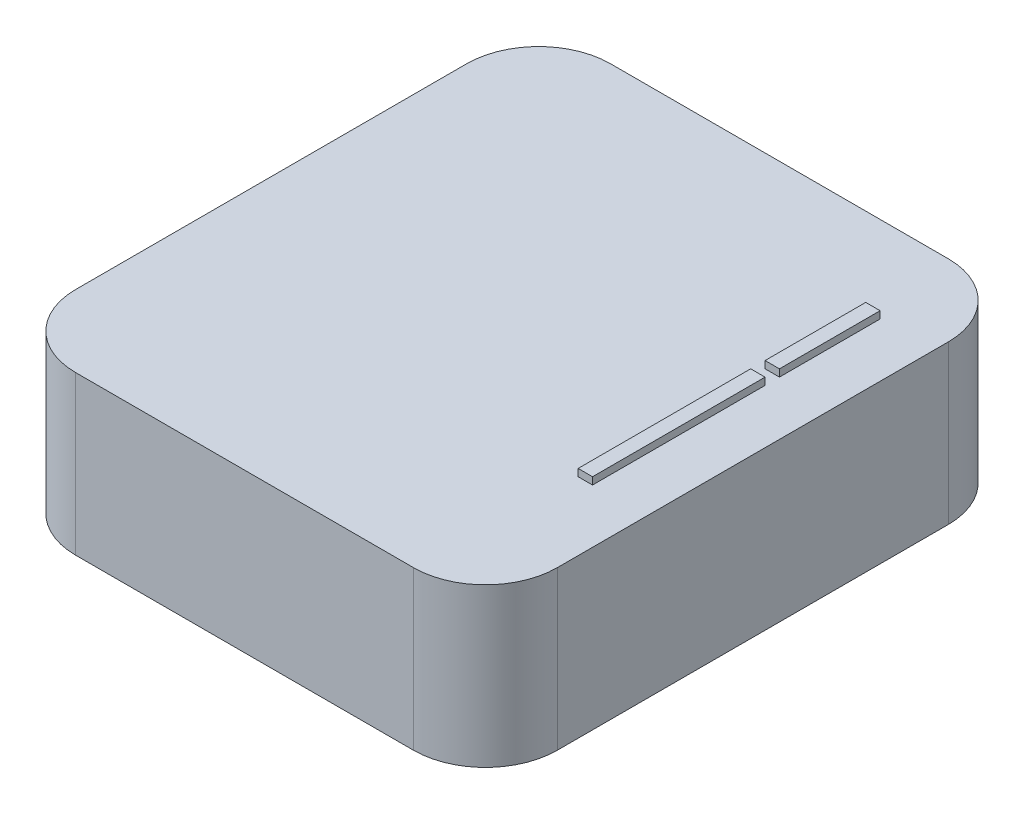
ISO-10303-21;
HEADER;
FILE_DESCRIPTION(('STEP AP214'),'2;1');
FILE_NAME('part.step','',(''),(''),'','','');
FILE_SCHEMA(('AUTOMOTIVE_DESIGN { 1 0 10303 214 1 1 1 1 }'));
ENDSEC;
DATA;
#1=APPLICATION_CONTEXT('core data for automotive mechanical design processes');
#2=APPLICATION_PROTOCOL_DEFINITION('international standard','automotive_design',2000,#1);
#3=PRODUCT_CONTEXT('',#1,'mechanical');
#4=PRODUCT('Part','Part','',(#3));
#5=PRODUCT_RELATED_PRODUCT_CATEGORY('part','',(#4));
#6=PRODUCT_DEFINITION_FORMATION('','',#4);
#7=PRODUCT_DEFINITION_CONTEXT('part definition',#1,'design');
#8=PRODUCT_DEFINITION('design','',#6,#7);
#9=PRODUCT_DEFINITION_SHAPE('','',#8);
#10=(LENGTH_UNIT() NAMED_UNIT(*) SI_UNIT(.MILLI.,.METRE.));
#11=(NAMED_UNIT(*) PLANE_ANGLE_UNIT() SI_UNIT($,.RADIAN.));
#12=(NAMED_UNIT(*) SI_UNIT($,.STERADIAN.) SOLID_ANGLE_UNIT());
#13=UNCERTAINTY_MEASURE_WITH_UNIT(LENGTH_MEASURE(1.E-05),#10,'distance_accuracy_value','');
#14=(GEOMETRIC_REPRESENTATION_CONTEXT(3) GLOBAL_UNCERTAINTY_ASSIGNED_CONTEXT((#13)) GLOBAL_UNIT_ASSIGNED_CONTEXT((#10,
#11,#12)) REPRESENTATION_CONTEXT('',''));
#15=CARTESIAN_POINT('',(0.,0.,0.));
#16=DIRECTION('',(0.,0.,1.));
#17=DIRECTION('',(1.,0.,0.));
#18=AXIS2_PLACEMENT_3D('',#15,#16,#17);
#19=CARTESIAN_POINT('',(0.,22.,0.));
#20=DIRECTION('',(0.,-1.,0.));
#21=DIRECTION('',(0.,0.,-1.));
#22=AXIS2_PLACEMENT_3D('',#19,#20,#21);
#23=PLANE('',#22);
#24=DIRECTION('',(0.,0.,1.));
#25=VECTOR('',#24,1.);
#26=CARTESIAN_POINT('',(24.,22.,-25.2));
#27=LINE('',#26,#25);
#28=CARTESIAN_POINT('',(24.,22.,-25.2));
#29=VERTEX_POINT('',#28);
#30=CARTESIAN_POINT('',(24.,22.,-11.2));
#31=VERTEX_POINT('',#30);
#32=EDGE_CURVE('E217',#29,#31,#27,.T.);
#33=ORIENTED_EDGE('',*,*,#32,.F.);
#34=DIRECTION('',(-1.,0.,0.));
#35=VECTOR('',#34,1.);
#36=CARTESIAN_POINT('',(24.,22.,-25.2));
#37=LINE('',#36,#35);
#38=CARTESIAN_POINT('',(26.,22.,-25.2));
#39=VERTEX_POINT('',#38);
#40=EDGE_CURVE('E230',#39,#29,#37,.T.);
#41=ORIENTED_EDGE('',*,*,#40,.F.);
#42=DIRECTION('',(0.,0.,-1.));
#43=VECTOR('',#42,1.);
#44=CARTESIAN_POINT('',(26.,22.,-25.2));
#45=LINE('',#44,#43);
#46=CARTESIAN_POINT('',(26.,22.,-11.2));
#47=VERTEX_POINT('',#46);
#48=EDGE_CURVE('E239',#47,#39,#45,.T.);
#49=ORIENTED_EDGE('',*,*,#48,.F.);
#50=DIRECTION('',(1.,0.,0.));
#51=VECTOR('',#50,1.);
#52=CARTESIAN_POINT('',(24.,22.,-11.2));
#53=LINE('',#52,#51);
#54=EDGE_CURVE('E220',#31,#47,#53,.T.);
#55=ORIENTED_EDGE('',*,*,#54,.F.);
#56=EDGE_LOOP('',(#33,#41,#49,#55));
#57=FACE_BOUND('',#56,.T.);
#58=DIRECTION('',(-1.,0.,0.));
#59=VECTOR('',#58,1.);
#60=CARTESIAN_POINT('',(-33.5,22.,-37.2));
#61=LINE('',#60,#59);
#62=CARTESIAN_POINT('',(23.5,22.,-37.2));
#63=VERTEX_POINT('',#62);
#64=CARTESIAN_POINT('',(-23.5,22.,-37.2));
#65=VERTEX_POINT('',#64);
#66=EDGE_CURVE('E323',#63,#65,#61,.T.);
#67=ORIENTED_EDGE('',*,*,#66,.T.);
#68=CARTESIAN_POINT('',(-23.5,22.,-27.2));
#69=DIRECTION('',(0.,-1.,0.));
#70=DIRECTION('',(0.,0.,-1.));
#71=AXIS2_PLACEMENT_3D('',#68,#69,#70);
#72=CIRCLE('',#71,10.);
#73=CARTESIAN_POINT('',(-33.5,22.,-27.2));
#74=VERTEX_POINT('',#73);
#75=EDGE_CURVE('E367',#65,#74,#72,.F.);
#76=ORIENTED_EDGE('',*,*,#75,.T.);
#77=DIRECTION('',(0.,0.,1.));
#78=VECTOR('',#77,1.);
#79=CARTESIAN_POINT('',(-33.5,22.,37.2));
#80=LINE('',#79,#78);
#81=CARTESIAN_POINT('',(-33.5,22.,27.2));
#82=VERTEX_POINT('',#81);
#83=EDGE_CURVE('E327',#74,#82,#80,.T.);
#84=ORIENTED_EDGE('',*,*,#83,.T.);
#85=CARTESIAN_POINT('',(-23.5,22.,27.2));
#86=DIRECTION('',(0.,-1.,0.));
#87=DIRECTION('',(0.,0.,-1.));
#88=AXIS2_PLACEMENT_3D('',#85,#86,#87);
#89=CIRCLE('',#88,10.);
#90=CARTESIAN_POINT('',(-23.5,22.,37.2));
#91=VERTEX_POINT('',#90);
#92=EDGE_CURVE('E363',#82,#91,#89,.F.);
#93=ORIENTED_EDGE('',*,*,#92,.T.);
#94=DIRECTION('',(1.,0.,0.));
#95=VECTOR('',#94,1.);
#96=CARTESIAN_POINT('',(-33.5,22.,37.2));
#97=LINE('',#96,#95);
#98=CARTESIAN_POINT('',(23.5,22.,37.2));
#99=VERTEX_POINT('',#98);
#100=EDGE_CURVE('E330',#91,#99,#97,.T.);
#101=ORIENTED_EDGE('',*,*,#100,.T.);
#102=CARTESIAN_POINT('',(23.5,22.,27.2));
#103=DIRECTION('',(0.,-1.,0.));
#104=DIRECTION('',(0.,0.,-1.));
#105=AXIS2_PLACEMENT_3D('',#102,#103,#104);
#106=CIRCLE('',#105,10.);
#107=CARTESIAN_POINT('',(33.5,22.,27.2));
#108=VERTEX_POINT('',#107);
#109=EDGE_CURVE('E361',#99,#108,#106,.F.);
#110=ORIENTED_EDGE('',*,*,#109,.T.);
#111=DIRECTION('',(0.,0.,-1.));
#112=VECTOR('',#111,1.);
#113=CARTESIAN_POINT('',(33.5,22.,37.2));
#114=LINE('',#113,#112);
#115=CARTESIAN_POINT('',(33.5,22.,-27.2));
#116=VERTEX_POINT('',#115);
#117=EDGE_CURVE('E320',#108,#116,#114,.T.);
#118=ORIENTED_EDGE('',*,*,#117,.T.);
#119=CARTESIAN_POINT('',(23.5,22.,-27.2));
#120=DIRECTION('',(0.,-1.,0.));
#121=DIRECTION('',(0.,0.,-1.));
#122=AXIS2_PLACEMENT_3D('',#119,#120,#121);
#123=CIRCLE('',#122,10.);
#124=EDGE_CURVE('E365',#116,#63,#123,.F.);
#125=ORIENTED_EDGE('',*,*,#124,.T.);
#126=EDGE_LOOP('',(#67,#76,#84,#93,#101,#110,#118,#125));
#127=FACE_BOUND('',#126,.T.);
#128=DIRECTION('',(0.,0.,1.));
#129=VECTOR('',#128,1.);
#130=CARTESIAN_POINT('',(24.,22.,-9.20000000000001));
#131=LINE('',#130,#129);
#132=CARTESIAN_POINT('',(24.,22.,-9.20000000000001));
#133=VERTEX_POINT('',#132);
#134=CARTESIAN_POINT('',(24.,22.,14.8));
#135=VERTEX_POINT('',#134);
#136=EDGE_CURVE('E216',#133,#135,#131,.T.);
#137=ORIENTED_EDGE('',*,*,#136,.F.);
#138=DIRECTION('',(-1.,0.,0.));
#139=VECTOR('',#138,1.);
#140=CARTESIAN_POINT('',(24.,22.,-9.20000000000001));
#141=LINE('',#140,#139);
#142=CARTESIAN_POINT('',(26.,22.,-9.20000000000001));
#143=VERTEX_POINT('',#142);
#144=EDGE_CURVE('E213',#143,#133,#141,.T.);
#145=ORIENTED_EDGE('',*,*,#144,.F.);
#146=DIRECTION('',(0.,0.,-1.));
#147=VECTOR('',#146,1.);
#148=CARTESIAN_POINT('',(26.,22.,-9.20000000000001));
#149=LINE('',#148,#147);
#150=CARTESIAN_POINT('',(26.,22.,14.8));
#151=VERTEX_POINT('',#150);
#152=EDGE_CURVE('E55',#151,#143,#149,.T.);
#153=ORIENTED_EDGE('',*,*,#152,.F.);
#154=DIRECTION('',(1.,0.,0.));
#155=VECTOR('',#154,1.);
#156=CARTESIAN_POINT('',(24.,22.,14.8));
#157=LINE('',#156,#155);
#158=EDGE_CURVE('E50',#135,#151,#157,.T.);
#159=ORIENTED_EDGE('',*,*,#158,.F.);
#160=EDGE_LOOP('',(#137,#145,#153,#159));
#161=FACE_BOUND('',#160,.T.);
#162=ADVANCED_FACE('F35',(#57,#127,#161),#23,.F.);
#163=CARTESIAN_POINT('',(33.5,22.,37.2));
#164=DIRECTION('',(-1.,0.,0.));
#165=DIRECTION('',(0.,0.,1.));
#166=AXIS2_PLACEMENT_3D('',#163,#164,#165);
#167=PLANE('',#166);
#168=DIRECTION('',(0.,0.,-1.));
#169=VECTOR('',#168,1.);
#170=CARTESIAN_POINT('',(33.5,0.,37.2));
#171=LINE('',#170,#169);
#172=CARTESIAN_POINT('',(33.5,0.,27.2));
#173=VERTEX_POINT('',#172);
#174=CARTESIAN_POINT('',(33.5,0.,-27.2));
#175=VERTEX_POINT('',#174);
#176=EDGE_CURVE('E313',#173,#175,#171,.T.);
#177=ORIENTED_EDGE('',*,*,#176,.T.);
#178=DIRECTION('',(0.,-1.,0.));
#179=VECTOR('',#178,1.);
#180=CARTESIAN_POINT('',(33.5,22.,-27.2));
#181=LINE('',#180,#179);
#182=EDGE_CURVE('E372',#175,#116,#181,.F.);
#183=ORIENTED_EDGE('',*,*,#182,.T.);
#184=ORIENTED_EDGE('',*,*,#117,.F.);
#185=DIRECTION('',(0.,-1.,0.));
#186=VECTOR('',#185,1.);
#187=CARTESIAN_POINT('',(33.5,22.,27.2));
#188=LINE('',#187,#186);
#189=EDGE_CURVE('E369',#108,#173,#188,.T.);
#190=ORIENTED_EDGE('',*,*,#189,.T.);
#191=EDGE_LOOP('',(#177,#183,#184,#190));
#192=FACE_BOUND('',#191,.T.);
#193=ADVANCED_FACE('F387',(#192),#167,.F.);
#194=CARTESIAN_POINT('',(-33.5,22.,-37.2));
#195=DIRECTION('',(0.,0.,1.));
#196=DIRECTION('',(1.,0.,0.));
#197=AXIS2_PLACEMENT_3D('',#194,#195,#196);
#198=PLANE('',#197);
#199=DIRECTION('',(1.,0.,0.));
#200=VECTOR('',#199,1.);
#201=CARTESIAN_POINT('',(-5.5,10.,-37.2));
#202=LINE('',#201,#200);
#203=CARTESIAN_POINT('',(-15.5,10.,-37.2));
#204=VERTEX_POINT('',#203);
#205=CARTESIAN_POINT('',(-5.5,10.,-37.2));
#206=VERTEX_POINT('',#205);
#207=EDGE_CURVE('E271',#204,#206,#202,.T.);
#208=ORIENTED_EDGE('',*,*,#207,.F.);
#209=DIRECTION('',(0.,1.,0.));
#210=VECTOR('',#209,1.);
#211=CARTESIAN_POINT('',(-15.5,10.,-37.2));
#212=LINE('',#211,#210);
#213=CARTESIAN_POINT('',(-15.5,5.,-37.2));
#214=VERTEX_POINT('',#213);
#215=EDGE_CURVE('E255',#214,#204,#212,.T.);
#216=ORIENTED_EDGE('',*,*,#215,.F.);
#217=DIRECTION('',(-1.,0.,0.));
#218=VECTOR('',#217,1.);
#219=CARTESIAN_POINT('',(-5.5,5.,-37.2));
#220=LINE('',#219,#218);
#221=CARTESIAN_POINT('',(-5.5,5.,-37.2));
#222=VERTEX_POINT('',#221);
#223=EDGE_CURVE('E260',#222,#214,#220,.T.);
#224=ORIENTED_EDGE('',*,*,#223,.F.);
#225=DIRECTION('',(0.,-1.,0.));
#226=VECTOR('',#225,1.);
#227=CARTESIAN_POINT('',(-5.5,10.,-37.2));
#228=LINE('',#227,#226);
#229=EDGE_CURVE('E274',#206,#222,#228,.T.);
#230=ORIENTED_EDGE('',*,*,#229,.F.);
#231=EDGE_LOOP('',(#208,#216,#224,#230));
#232=FACE_BOUND('',#231,.T.);
#233=DIRECTION('',(1.,0.,0.));
#234=VECTOR('',#233,1.);
#235=CARTESIAN_POINT('',(12.5,19.,-37.2));
#236=LINE('',#235,#234);
#237=CARTESIAN_POINT('',(-2.5,19.,-37.2));
#238=VERTEX_POINT('',#237);
#239=CARTESIAN_POINT('',(12.5,19.,-37.2));
#240=VERTEX_POINT('',#239);
#241=EDGE_CURVE('E303',#238,#240,#236,.T.);
#242=ORIENTED_EDGE('',*,*,#241,.F.);
#243=DIRECTION('',(0.,1.,0.));
#244=VECTOR('',#243,1.);
#245=CARTESIAN_POINT('',(-2.5,19.,-37.2));
#246=LINE('',#245,#244);
#247=CARTESIAN_POINT('',(-2.5,6.,-37.2));
#248=VERTEX_POINT('',#247);
#249=EDGE_CURVE('E281',#248,#238,#246,.T.);
#250=ORIENTED_EDGE('',*,*,#249,.F.);
#251=DIRECTION('',(-1.,0.,0.));
#252=VECTOR('',#251,1.);
#253=CARTESIAN_POINT('',(12.5,6.,-37.2));
#254=LINE('',#253,#252);
#255=CARTESIAN_POINT('',(12.5,6.,-37.2));
#256=VERTEX_POINT('',#255);
#257=EDGE_CURVE('E292',#256,#248,#254,.T.);
#258=ORIENTED_EDGE('',*,*,#257,.F.);
#259=DIRECTION('',(0.,-1.,0.));
#260=VECTOR('',#259,1.);
#261=CARTESIAN_POINT('',(12.5,19.,-37.2));
#262=LINE('',#261,#260);
#263=EDGE_CURVE('E306',#240,#256,#262,.T.);
#264=ORIENTED_EDGE('',*,*,#263,.F.);
#265=EDGE_LOOP('',(#242,#250,#258,#264));
#266=FACE_BOUND('',#265,.T.);
#267=DIRECTION('',(-1.,0.,0.));
#268=VECTOR('',#267,1.);
#269=CARTESIAN_POINT('',(-33.5,0.,-37.2));
#270=LINE('',#269,#268);
#271=CARTESIAN_POINT('',(23.5,0.,-37.2));
#272=VERTEX_POINT('',#271);
#273=CARTESIAN_POINT('',(-23.5,0.,-37.2));
#274=VERTEX_POINT('',#273);
#275=EDGE_CURVE('E336',#272,#274,#270,.T.);
#276=ORIENTED_EDGE('',*,*,#275,.T.);
#277=DIRECTION('',(0.,-1.,0.));
#278=VECTOR('',#277,1.);
#279=CARTESIAN_POINT('',(-23.5,22.,-37.2));
#280=LINE('',#279,#278);
#281=EDGE_CURVE('E359',#274,#65,#280,.F.);
#282=ORIENTED_EDGE('',*,*,#281,.T.);
#283=ORIENTED_EDGE('',*,*,#66,.F.);
#284=DIRECTION('',(0.,-1.,0.));
#285=VECTOR('',#284,1.);
#286=CARTESIAN_POINT('',(23.5,22.,-37.2));
#287=LINE('',#286,#285);
#288=EDGE_CURVE('E356',#63,#272,#287,.T.);
#289=ORIENTED_EDGE('',*,*,#288,.T.);
#290=EDGE_LOOP('',(#276,#282,#283,#289));
#291=FACE_BOUND('',#290,.T.);
#292=ADVANCED_FACE('F399',(#232,#266,#291),#198,.F.);
#293=CARTESIAN_POINT('',(-33.5,22.,37.2));
#294=DIRECTION('',(1.,0.,0.));
#295=DIRECTION('',(0.,0.,-1.));
#296=AXIS2_PLACEMENT_3D('',#293,#294,#295);
#297=PLANE('',#296);
#298=ORIENTED_EDGE('',*,*,#83,.F.);
#299=DIRECTION('',(0.,-1.,0.));
#300=VECTOR('',#299,1.);
#301=CARTESIAN_POINT('',(-33.5,22.,-27.2));
#302=LINE('',#301,#300);
#303=CARTESIAN_POINT('',(-33.5,0.,-27.2));
#304=VERTEX_POINT('',#303);
#305=EDGE_CURVE('E345',#74,#304,#302,.T.);
#306=ORIENTED_EDGE('',*,*,#305,.T.);
#307=DIRECTION('',(0.,0.,1.));
#308=VECTOR('',#307,1.);
#309=CARTESIAN_POINT('',(-33.5,0.,37.2));
#310=LINE('',#309,#308);
#311=CARTESIAN_POINT('',(-33.5,0.,27.2));
#312=VERTEX_POINT('',#311);
#313=EDGE_CURVE('E339',#304,#312,#310,.T.);
#314=ORIENTED_EDGE('',*,*,#313,.T.);
#315=DIRECTION('',(0.,-1.,0.));
#316=VECTOR('',#315,1.);
#317=CARTESIAN_POINT('',(-33.5,22.,27.2));
#318=LINE('',#317,#316);
#319=EDGE_CURVE('E333',#312,#82,#318,.F.);
#320=ORIENTED_EDGE('',*,*,#319,.T.);
#321=EDGE_LOOP('',(#298,#306,#314,#320));
#322=FACE_BOUND('',#321,.T.);
#323=ADVANCED_FACE('F407',(#322),#297,.F.);
#324=CARTESIAN_POINT('',(-33.5,22.,37.2));
#325=DIRECTION('',(0.,0.,-1.));
#326=DIRECTION('',(-1.,0.,0.));
#327=AXIS2_PLACEMENT_3D('',#324,#325,#326);
#328=PLANE('',#327);
#329=ORIENTED_EDGE('',*,*,#100,.F.);
#330=DIRECTION('',(0.,-1.,0.));
#331=VECTOR('',#330,1.);
#332=CARTESIAN_POINT('',(-23.5,22.,37.2));
#333=LINE('',#332,#331);
#334=CARTESIAN_POINT('',(-23.5,0.,37.2));
#335=VERTEX_POINT('',#334);
#336=EDGE_CURVE('E11',#91,#335,#333,.T.);
#337=ORIENTED_EDGE('',*,*,#336,.T.);
#338=DIRECTION('',(1.,0.,0.));
#339=VECTOR('',#338,1.);
#340=CARTESIAN_POINT('',(-33.5,0.,37.2));
#341=LINE('',#340,#339);
#342=CARTESIAN_POINT('',(23.5,0.,37.2));
#343=VERTEX_POINT('',#342);
#344=EDGE_CURVE('E324',#335,#343,#341,.T.);
#345=ORIENTED_EDGE('',*,*,#344,.T.);
#346=DIRECTION('',(0.,-1.,0.));
#347=VECTOR('',#346,1.);
#348=CARTESIAN_POINT('',(23.5,22.,37.2));
#349=LINE('',#348,#347);
#350=EDGE_CURVE('E43',#343,#99,#349,.F.);
#351=ORIENTED_EDGE('',*,*,#350,.T.);
#352=EDGE_LOOP('',(#329,#337,#345,#351));
#353=FACE_BOUND('',#352,.T.);
#354=ADVANCED_FACE('F376',(#353),#328,.F.);
#355=CARTESIAN_POINT('',(0.,0.,0.));
#356=DIRECTION('',(0.,-1.,0.));
#357=DIRECTION('',(0.,0.,-1.));
#358=AXIS2_PLACEMENT_3D('',#355,#356,#357);
#359=PLANE('',#358);
#360=ORIENTED_EDGE('',*,*,#313,.F.);
#361=CARTESIAN_POINT('',(-23.5,0.,-27.2));
#362=DIRECTION('',(0.,-1.,0.));
#363=DIRECTION('',(0.,0.,-1.));
#364=AXIS2_PLACEMENT_3D('',#361,#362,#363);
#365=CIRCLE('',#364,10.);
#366=EDGE_CURVE('E354',#304,#274,#365,.T.);
#367=ORIENTED_EDGE('',*,*,#366,.T.);
#368=ORIENTED_EDGE('',*,*,#275,.F.);
#369=CARTESIAN_POINT('',(23.5,0.,-27.2));
#370=DIRECTION('',(0.,-1.,0.));
#371=DIRECTION('',(0.,0.,-1.));
#372=AXIS2_PLACEMENT_3D('',#369,#370,#371);
#373=CIRCLE('',#372,10.);
#374=EDGE_CURVE('E352',#272,#175,#373,.T.);
#375=ORIENTED_EDGE('',*,*,#374,.T.);
#376=ORIENTED_EDGE('',*,*,#176,.F.);
#377=CARTESIAN_POINT('',(23.5,0.,27.2));
#378=DIRECTION('',(0.,-1.,0.));
#379=DIRECTION('',(0.,0.,-1.));
#380=AXIS2_PLACEMENT_3D('',#377,#378,#379);
#381=CIRCLE('',#380,10.);
#382=EDGE_CURVE('E348',#173,#343,#381,.T.);
#383=ORIENTED_EDGE('',*,*,#382,.T.);
#384=ORIENTED_EDGE('',*,*,#344,.F.);
#385=CARTESIAN_POINT('',(-23.5,0.,27.2));
#386=DIRECTION('',(0.,-1.,0.));
#387=DIRECTION('',(0.,0.,-1.));
#388=AXIS2_PLACEMENT_3D('',#385,#386,#387);
#389=CIRCLE('',#388,10.);
#390=EDGE_CURVE('E350',#335,#312,#389,.T.);
#391=ORIENTED_EDGE('',*,*,#390,.T.);
#392=EDGE_LOOP('',(#360,#367,#368,#375,#376,#383,#384,#391));
#393=FACE_BOUND('',#392,.T.);
#394=ADVANCED_FACE('F391',(#393),#359,.T.);
#395=CARTESIAN_POINT('',(-23.5,22.,-27.2));
#396=DIRECTION('',(0.,-1.,0.));
#397=DIRECTION('',(0.,0.,-1.));
#398=AXIS2_PLACEMENT_3D('',#395,#396,#397);
#399=CYLINDRICAL_SURFACE('',#398,10.);
#400=ORIENTED_EDGE('',*,*,#75,.F.);
#401=ORIENTED_EDGE('',*,*,#281,.F.);
#402=ORIENTED_EDGE('',*,*,#366,.F.);
#403=ORIENTED_EDGE('',*,*,#305,.F.);
#404=EDGE_LOOP('',(#400,#401,#402,#403));
#405=FACE_BOUND('',#404,.T.);
#406=ADVANCED_FACE('F405',(#405),#399,.T.);
#407=CARTESIAN_POINT('',(23.5,22.,-27.2));
#408=DIRECTION('',(0.,-1.,0.));
#409=DIRECTION('',(0.,0.,-1.));
#410=AXIS2_PLACEMENT_3D('',#407,#408,#409);
#411=CYLINDRICAL_SURFACE('',#410,10.);
#412=ORIENTED_EDGE('',*,*,#124,.F.);
#413=ORIENTED_EDGE('',*,*,#182,.F.);
#414=ORIENTED_EDGE('',*,*,#374,.F.);
#415=ORIENTED_EDGE('',*,*,#288,.F.);
#416=EDGE_LOOP('',(#412,#413,#414,#415));
#417=FACE_BOUND('',#416,.T.);
#418=ADVANCED_FACE('F396',(#417),#411,.T.);
#419=CARTESIAN_POINT('',(-23.5,22.,27.2));
#420=DIRECTION('',(0.,-1.,0.));
#421=DIRECTION('',(0.,0.,-1.));
#422=AXIS2_PLACEMENT_3D('',#419,#420,#421);
#423=CYLINDRICAL_SURFACE('',#422,10.);
#424=ORIENTED_EDGE('',*,*,#92,.F.);
#425=ORIENTED_EDGE('',*,*,#319,.F.);
#426=ORIENTED_EDGE('',*,*,#390,.F.);
#427=ORIENTED_EDGE('',*,*,#336,.F.);
#428=EDGE_LOOP('',(#424,#425,#426,#427));
#429=FACE_BOUND('',#428,.T.);
#430=ADVANCED_FACE('F410',(#429),#423,.T.);
#431=CARTESIAN_POINT('',(23.5,22.,27.2));
#432=DIRECTION('',(0.,-1.,0.));
#433=DIRECTION('',(0.,0.,-1.));
#434=AXIS2_PLACEMENT_3D('',#431,#432,#433);
#435=CYLINDRICAL_SURFACE('',#434,10.);
#436=ORIENTED_EDGE('',*,*,#109,.F.);
#437=ORIENTED_EDGE('',*,*,#350,.F.);
#438=ORIENTED_EDGE('',*,*,#382,.F.);
#439=ORIENTED_EDGE('',*,*,#189,.F.);
#440=EDGE_LOOP('',(#436,#437,#438,#439));
#441=FACE_BOUND('',#440,.T.);
#442=ADVANCED_FACE('F37',(#441),#435,.T.);
#443=CARTESIAN_POINT('',(-2.5,19.,-27.2));
#444=DIRECTION('',(-1.,0.,0.));
#445=DIRECTION('',(0.,-1.,0.));
#446=AXIS2_PLACEMENT_3D('',#443,#444,#445);
#447=PLANE('',#446);
#448=ORIENTED_EDGE('',*,*,#249,.T.);
#449=DIRECTION('',(0.,0.,-1.));
#450=VECTOR('',#449,1.);
#451=CARTESIAN_POINT('',(-2.5,19.,-27.2));
#452=LINE('',#451,#450);
#453=CARTESIAN_POINT('',(-2.5,19.,-27.2));
#454=VERTEX_POINT('',#453);
#455=EDGE_CURVE('E301',#454,#238,#452,.T.);
#456=ORIENTED_EDGE('',*,*,#455,.F.);
#457=DIRECTION('',(0.,1.,0.));
#458=VECTOR('',#457,1.);
#459=CARTESIAN_POINT('',(-2.5,19.,-27.2));
#460=LINE('',#459,#458);
#461=CARTESIAN_POINT('',(-2.5,6.,-27.2));
#462=VERTEX_POINT('',#461);
#463=EDGE_CURVE('E288',#462,#454,#460,.T.);
#464=ORIENTED_EDGE('',*,*,#463,.F.);
#465=DIRECTION('',(0.,0.,-1.));
#466=VECTOR('',#465,1.);
#467=CARTESIAN_POINT('',(-2.5,6.,-27.2));
#468=LINE('',#467,#466);
#469=EDGE_CURVE('E311',#462,#248,#468,.T.);
#470=ORIENTED_EDGE('',*,*,#469,.T.);
#471=EDGE_LOOP('',(#448,#456,#464,#470));
#472=FACE_BOUND('',#471,.T.);
#473=ADVANCED_FACE('F416',(#472),#447,.F.);
#474=CARTESIAN_POINT('',(12.5,6.,-27.2));
#475=DIRECTION('',(0.,-1.,0.));
#476=DIRECTION('',(0.,0.,-1.));
#477=AXIS2_PLACEMENT_3D('',#474,#475,#476);
#478=PLANE('',#477);
#479=ORIENTED_EDGE('',*,*,#257,.T.);
#480=ORIENTED_EDGE('',*,*,#469,.F.);
#481=DIRECTION('',(-1.,0.,0.));
#482=VECTOR('',#481,1.);
#483=CARTESIAN_POINT('',(12.5,6.,-27.2));
#484=LINE('',#483,#482);
#485=CARTESIAN_POINT('',(12.5,6.,-27.2));
#486=VERTEX_POINT('',#485);
#487=EDGE_CURVE('E298',#486,#462,#484,.T.);
#488=ORIENTED_EDGE('',*,*,#487,.F.);
#489=DIRECTION('',(0.,0.,-1.));
#490=VECTOR('',#489,1.);
#491=CARTESIAN_POINT('',(12.5,6.,-27.2));
#492=LINE('',#491,#490);
#493=EDGE_CURVE('E314',#486,#256,#492,.T.);
#494=ORIENTED_EDGE('',*,*,#493,.T.);
#495=EDGE_LOOP('',(#479,#480,#488,#494));
#496=FACE_BOUND('',#495,.T.);
#497=ADVANCED_FACE('F473',(#496),#478,.F.);
#498=CARTESIAN_POINT('',(12.5,19.,-27.2));
#499=DIRECTION('',(1.,0.,0.));
#500=DIRECTION('',(0.,1.,0.));
#501=AXIS2_PLACEMENT_3D('',#498,#499,#500);
#502=PLANE('',#501);
#503=ORIENTED_EDGE('',*,*,#263,.T.);
#504=ORIENTED_EDGE('',*,*,#493,.F.);
#505=DIRECTION('',(0.,-1.,0.));
#506=VECTOR('',#505,1.);
#507=CARTESIAN_POINT('',(12.5,19.,-27.2));
#508=LINE('',#507,#506);
#509=CARTESIAN_POINT('',(12.5,19.,-27.2));
#510=VERTEX_POINT('',#509);
#511=EDGE_CURVE('E295',#510,#486,#508,.T.);
#512=ORIENTED_EDGE('',*,*,#511,.F.);
#513=DIRECTION('',(0.,0.,-1.));
#514=VECTOR('',#513,1.);
#515=CARTESIAN_POINT('',(12.5,19.,-27.2));
#516=LINE('',#515,#514);
#517=EDGE_CURVE('E316',#510,#240,#516,.T.);
#518=ORIENTED_EDGE('',*,*,#517,.T.);
#519=EDGE_LOOP('',(#503,#504,#512,#518));
#520=FACE_BOUND('',#519,.T.);
#521=ADVANCED_FACE('F482',(#520),#502,.F.);
#522=CARTESIAN_POINT('',(12.5,19.,-27.2));
#523=DIRECTION('',(0.,1.,0.));
#524=DIRECTION('',(0.,0.,1.));
#525=AXIS2_PLACEMENT_3D('',#522,#523,#524);
#526=PLANE('',#525);
#527=ORIENTED_EDGE('',*,*,#241,.T.);
#528=ORIENTED_EDGE('',*,*,#517,.F.);
#529=DIRECTION('',(1.,0.,0.));
#530=VECTOR('',#529,1.);
#531=CARTESIAN_POINT('',(12.5,19.,-27.2));
#532=LINE('',#531,#530);
#533=EDGE_CURVE('E291',#454,#510,#532,.T.);
#534=ORIENTED_EDGE('',*,*,#533,.F.);
#535=ORIENTED_EDGE('',*,*,#455,.T.);
#536=EDGE_LOOP('',(#527,#528,#534,#535));
#537=FACE_BOUND('',#536,.T.);
#538=ADVANCED_FACE('F492',(#537),#526,.F.);
#539=CARTESIAN_POINT('',(0.,0.,-27.2));
#540=DIRECTION('',(0.,0.,-1.));
#541=DIRECTION('',(-1.,0.,0.));
#542=AXIS2_PLACEMENT_3D('',#539,#540,#541);
#543=PLANE('',#542);
#544=ORIENTED_EDGE('',*,*,#463,.T.);
#545=ORIENTED_EDGE('',*,*,#533,.T.);
#546=ORIENTED_EDGE('',*,*,#511,.T.);
#547=ORIENTED_EDGE('',*,*,#487,.T.);
#548=EDGE_LOOP('',(#544,#545,#546,#547));
#549=FACE_BOUND('',#548,.T.);
#550=ADVANCED_FACE('F502',(#549),#543,.T.);
#551=CARTESIAN_POINT('',(-15.5,10.,-27.2));
#552=DIRECTION('',(-1.,0.,0.));
#553=DIRECTION('',(0.,0.,1.));
#554=AXIS2_PLACEMENT_3D('',#551,#552,#553);
#555=PLANE('',#554);
#556=ORIENTED_EDGE('',*,*,#215,.T.);
#557=DIRECTION('',(0.,0.,-1.));
#558=VECTOR('',#557,1.);
#559=CARTESIAN_POINT('',(-15.5,10.,-27.2));
#560=LINE('',#559,#558);
#561=CARTESIAN_POINT('',(-15.5,10.,-27.2));
#562=VERTEX_POINT('',#561);
#563=EDGE_CURVE('E269',#562,#204,#560,.T.);
#564=ORIENTED_EDGE('',*,*,#563,.F.);
#565=DIRECTION('',(0.,1.,0.));
#566=VECTOR('',#565,1.);
#567=CARTESIAN_POINT('',(-15.5,10.,-27.2));
#568=LINE('',#567,#566);
#569=CARTESIAN_POINT('',(-15.5,5.,-27.2));
#570=VERTEX_POINT('',#569);
#571=EDGE_CURVE('E256',#570,#562,#568,.T.);
#572=ORIENTED_EDGE('',*,*,#571,.F.);
#573=DIRECTION('',(0.,0.,-1.));
#574=VECTOR('',#573,1.);
#575=CARTESIAN_POINT('',(-15.5,5.,-27.2));
#576=LINE('',#575,#574);
#577=EDGE_CURVE('E279',#570,#214,#576,.T.);
#578=ORIENTED_EDGE('',*,*,#577,.T.);
#579=EDGE_LOOP('',(#556,#564,#572,#578));
#580=FACE_BOUND('',#579,.T.);
#581=ADVANCED_FACE('F511',(#580),#555,.F.);
#582=CARTESIAN_POINT('',(-5.5,5.,-27.2));
#583=DIRECTION('',(0.,-1.,0.));
#584=DIRECTION('',(0.,0.,-1.));
#585=AXIS2_PLACEMENT_3D('',#582,#583,#584);
#586=PLANE('',#585);
#587=ORIENTED_EDGE('',*,*,#223,.T.);
#588=ORIENTED_EDGE('',*,*,#577,.F.);
#589=DIRECTION('',(-1.,0.,0.));
#590=VECTOR('',#589,1.);
#591=CARTESIAN_POINT('',(-5.5,5.,-27.2));
#592=LINE('',#591,#590);
#593=CARTESIAN_POINT('',(-5.5,5.,-27.2));
#594=VERTEX_POINT('',#593);
#595=EDGE_CURVE('E266',#594,#570,#592,.T.);
#596=ORIENTED_EDGE('',*,*,#595,.F.);
#597=DIRECTION('',(0.,0.,-1.));
#598=VECTOR('',#597,1.);
#599=CARTESIAN_POINT('',(-5.5,5.,-27.2));
#600=LINE('',#599,#598);
#601=EDGE_CURVE('E282',#594,#222,#600,.T.);
#602=ORIENTED_EDGE('',*,*,#601,.T.);
#603=EDGE_LOOP('',(#587,#588,#596,#602));
#604=FACE_BOUND('',#603,.T.);
#605=ADVANCED_FACE('F521',(#604),#586,.F.);
#606=CARTESIAN_POINT('',(-5.5,10.,-27.2));
#607=DIRECTION('',(1.,0.,0.));
#608=DIRECTION('',(0.,1.,0.));
#609=AXIS2_PLACEMENT_3D('',#606,#607,#608);
#610=PLANE('',#609);
#611=ORIENTED_EDGE('',*,*,#229,.T.);
#612=ORIENTED_EDGE('',*,*,#601,.F.);
#613=DIRECTION('',(0.,-1.,0.));
#614=VECTOR('',#613,1.);
#615=CARTESIAN_POINT('',(-5.5,10.,-27.2));
#616=LINE('',#615,#614);
#617=CARTESIAN_POINT('',(-5.5,10.,-27.2));
#618=VERTEX_POINT('',#617);
#619=EDGE_CURVE('E263',#618,#594,#616,.T.);
#620=ORIENTED_EDGE('',*,*,#619,.F.);
#621=DIRECTION('',(0.,0.,-1.));
#622=VECTOR('',#621,1.);
#623=CARTESIAN_POINT('',(-5.5,10.,-27.2));
#624=LINE('',#623,#622);
#625=EDGE_CURVE('E284',#618,#206,#624,.T.);
#626=ORIENTED_EDGE('',*,*,#625,.T.);
#627=EDGE_LOOP('',(#611,#612,#620,#626));
#628=FACE_BOUND('',#627,.T.);
#629=ADVANCED_FACE('F531',(#628),#610,.F.);
#630=CARTESIAN_POINT('',(-5.5,10.,-27.2));
#631=DIRECTION('',(0.,1.,0.));
#632=DIRECTION('',(0.,0.,1.));
#633=AXIS2_PLACEMENT_3D('',#630,#631,#632);
#634=PLANE('',#633);
#635=ORIENTED_EDGE('',*,*,#207,.T.);
#636=ORIENTED_EDGE('',*,*,#625,.F.);
#637=DIRECTION('',(1.,0.,0.));
#638=VECTOR('',#637,1.);
#639=CARTESIAN_POINT('',(-5.5,10.,-27.2));
#640=LINE('',#639,#638);
#641=EDGE_CURVE('E259',#562,#618,#640,.T.);
#642=ORIENTED_EDGE('',*,*,#641,.F.);
#643=ORIENTED_EDGE('',*,*,#563,.T.);
#644=EDGE_LOOP('',(#635,#636,#642,#643));
#645=FACE_BOUND('',#644,.T.);
#646=ADVANCED_FACE('F541',(#645),#634,.F.);
#647=CARTESIAN_POINT('',(0.,0.,-27.2));
#648=DIRECTION('',(0.,0.,-1.));
#649=DIRECTION('',(-1.,0.,0.));
#650=AXIS2_PLACEMENT_3D('',#647,#648,#649);
#651=PLANE('',#650);
#652=ORIENTED_EDGE('',*,*,#571,.T.);
#653=ORIENTED_EDGE('',*,*,#641,.T.);
#654=ORIENTED_EDGE('',*,*,#619,.T.);
#655=ORIENTED_EDGE('',*,*,#595,.T.);
#656=EDGE_LOOP('',(#652,#653,#654,#655));
#657=FACE_BOUND('',#656,.T.);
#658=ADVANCED_FACE('F551',(#657),#651,.T.);
#659=CARTESIAN_POINT('',(24.,23.,-25.2));
#660=DIRECTION('',(1.,0.,0.));
#661=DIRECTION('',(0.,0.,-1.));
#662=AXIS2_PLACEMENT_3D('',#659,#660,#661);
#663=PLANE('',#662);
#664=ORIENTED_EDGE('',*,*,#32,.T.);
#665=DIRECTION('',(0.,-1.,0.));
#666=VECTOR('',#665,1.);
#667=CARTESIAN_POINT('',(24.,23.,-11.2));
#668=LINE('',#667,#666);
#669=CARTESIAN_POINT('',(24.,23.,-11.2));
#670=VERTEX_POINT('',#669);
#671=EDGE_CURVE('E252',#670,#31,#668,.T.);
#672=ORIENTED_EDGE('',*,*,#671,.F.);
#673=DIRECTION('',(0.,0.,1.));
#674=VECTOR('',#673,1.);
#675=CARTESIAN_POINT('',(24.,23.,-25.2));
#676=LINE('',#675,#674);
#677=CARTESIAN_POINT('',(24.,23.,-25.2));
#678=VERTEX_POINT('',#677);
#679=EDGE_CURVE('E226',#678,#670,#676,.T.);
#680=ORIENTED_EDGE('',*,*,#679,.F.);
#681=DIRECTION('',(0.,-1.,0.));
#682=VECTOR('',#681,1.);
#683=CARTESIAN_POINT('',(24.,23.,-25.2));
#684=LINE('',#683,#682);
#685=EDGE_CURVE('E235',#678,#29,#684,.T.);
#686=ORIENTED_EDGE('',*,*,#685,.T.);
#687=EDGE_LOOP('',(#664,#672,#680,#686));
#688=FACE_BOUND('',#687,.T.);
#689=ADVANCED_FACE('F560',(#688),#663,.F.);
#690=CARTESIAN_POINT('',(24.,23.,-11.2));
#691=DIRECTION('',(0.,0.,-1.));
#692=DIRECTION('',(-1.,0.,0.));
#693=AXIS2_PLACEMENT_3D('',#690,#691,#692);
#694=PLANE('',#693);
#695=ORIENTED_EDGE('',*,*,#54,.T.);
#696=DIRECTION('',(0.,-1.,0.));
#697=VECTOR('',#696,1.);
#698=CARTESIAN_POINT('',(26.,23.,-11.2));
#699=LINE('',#698,#697);
#700=CARTESIAN_POINT('',(26.,23.,-11.2));
#701=VERTEX_POINT('',#700);
#702=EDGE_CURVE('E249',#701,#47,#699,.T.);
#703=ORIENTED_EDGE('',*,*,#702,.F.);
#704=DIRECTION('',(1.,0.,0.));
#705=VECTOR('',#704,1.);
#706=CARTESIAN_POINT('',(24.,23.,-11.2));
#707=LINE('',#706,#705);
#708=EDGE_CURVE('E229',#670,#701,#707,.T.);
#709=ORIENTED_EDGE('',*,*,#708,.F.);
#710=ORIENTED_EDGE('',*,*,#671,.T.);
#711=EDGE_LOOP('',(#695,#703,#709,#710));
#712=FACE_BOUND('',#711,.T.);
#713=ADVANCED_FACE('F576',(#712),#694,.F.);
#714=CARTESIAN_POINT('',(26.,23.,-25.2));
#715=DIRECTION('',(-1.,0.,0.));
#716=DIRECTION('',(0.,0.,1.));
#717=AXIS2_PLACEMENT_3D('',#714,#715,#716);
#718=PLANE('',#717);
#719=ORIENTED_EDGE('',*,*,#48,.T.);
#720=DIRECTION('',(0.,-1.,0.));
#721=VECTOR('',#720,1.);
#722=CARTESIAN_POINT('',(26.,23.,-25.2));
#723=LINE('',#722,#721);
#724=CARTESIAN_POINT('',(26.,23.,-25.2));
#725=VERTEX_POINT('',#724);
#726=EDGE_CURVE('E246',#725,#39,#723,.T.);
#727=ORIENTED_EDGE('',*,*,#726,.F.);
#728=DIRECTION('',(0.,0.,-1.));
#729=VECTOR('',#728,1.);
#730=CARTESIAN_POINT('',(26.,23.,-25.2));
#731=LINE('',#730,#729);
#732=EDGE_CURVE('E232',#701,#725,#731,.T.);
#733=ORIENTED_EDGE('',*,*,#732,.F.);
#734=ORIENTED_EDGE('',*,*,#702,.T.);
#735=EDGE_LOOP('',(#719,#727,#733,#734));
#736=FACE_BOUND('',#735,.T.);
#737=ADVANCED_FACE('F589',(#736),#718,.F.);
#738=CARTESIAN_POINT('',(24.,23.,-25.2));
#739=DIRECTION('',(0.,0.,1.));
#740=DIRECTION('',(1.,0.,0.));
#741=AXIS2_PLACEMENT_3D('',#738,#739,#740);
#742=PLANE('',#741);
#743=ORIENTED_EDGE('',*,*,#40,.T.);
#744=ORIENTED_EDGE('',*,*,#685,.F.);
#745=DIRECTION('',(-1.,0.,0.));
#746=VECTOR('',#745,1.);
#747=CARTESIAN_POINT('',(24.,23.,-25.2));
#748=LINE('',#747,#746);
#749=EDGE_CURVE('E234',#725,#678,#748,.T.);
#750=ORIENTED_EDGE('',*,*,#749,.F.);
#751=ORIENTED_EDGE('',*,*,#726,.T.);
#752=EDGE_LOOP('',(#743,#744,#750,#751));
#753=FACE_BOUND('',#752,.T.);
#754=ADVANCED_FACE('F602',(#753),#742,.F.);
#755=CARTESIAN_POINT('',(0.,23.,0.));
#756=DIRECTION('',(0.,1.,0.));
#757=DIRECTION('',(0.,0.,1.));
#758=AXIS2_PLACEMENT_3D('',#755,#756,#757);
#759=PLANE('',#758);
#760=ORIENTED_EDGE('',*,*,#679,.T.);
#761=ORIENTED_EDGE('',*,*,#708,.T.);
#762=ORIENTED_EDGE('',*,*,#732,.T.);
#763=ORIENTED_EDGE('',*,*,#749,.T.);
#764=EDGE_LOOP('',(#760,#761,#762,#763));
#765=FACE_BOUND('',#764,.T.);
#766=ADVANCED_FACE('F613',(#765),#759,.T.);
#767=CARTESIAN_POINT('',(24.,23.,-9.20000000000001));
#768=DIRECTION('',(1.,0.,0.));
#769=DIRECTION('',(0.,0.,-1.));
#770=AXIS2_PLACEMENT_3D('',#767,#768,#769);
#771=PLANE('',#770);
#772=ORIENTED_EDGE('',*,*,#136,.T.);
#773=DIRECTION('',(0.,-1.,0.));
#774=VECTOR('',#773,1.);
#775=CARTESIAN_POINT('',(24.,23.,14.8));
#776=LINE('',#775,#774);
#777=CARTESIAN_POINT('',(24.,23.,14.8));
#778=VERTEX_POINT('',#777);
#779=EDGE_CURVE('E197',#778,#135,#776,.T.);
#780=ORIENTED_EDGE('',*,*,#779,.F.);
#781=DIRECTION('',(0.,0.,1.));
#782=VECTOR('',#781,1.);
#783=CARTESIAN_POINT('',(24.,23.,-9.20000000000001));
#784=LINE('',#783,#782);
#785=CARTESIAN_POINT('',(24.,23.,-9.20000000000001));
#786=VERTEX_POINT('',#785);
#787=EDGE_CURVE('E204',#786,#778,#784,.T.);
#788=ORIENTED_EDGE('',*,*,#787,.F.);
#789=DIRECTION('',(0.,-1.,0.));
#790=VECTOR('',#789,1.);
#791=CARTESIAN_POINT('',(24.,23.,-9.20000000000001));
#792=LINE('',#791,#790);
#793=EDGE_CURVE('E685',#786,#133,#792,.T.);
#794=ORIENTED_EDGE('',*,*,#793,.T.);
#795=EDGE_LOOP('',(#772,#780,#788,#794));
#796=FACE_BOUND('',#795,.T.);
#797=ADVANCED_FACE('F215',(#796),#771,.F.);
#798=CARTESIAN_POINT('',(24.,23.,14.8));
#799=DIRECTION('',(0.,0.,-1.));
#800=DIRECTION('',(-1.,0.,0.));
#801=AXIS2_PLACEMENT_3D('',#798,#799,#800);
#802=PLANE('',#801);
#803=ORIENTED_EDGE('',*,*,#158,.T.);
#804=DIRECTION('',(0.,-1.,0.));
#805=VECTOR('',#804,1.);
#806=CARTESIAN_POINT('',(26.,23.,14.8));
#807=LINE('',#806,#805);
#808=CARTESIAN_POINT('',(26.,23.,14.8));
#809=VERTEX_POINT('',#808);
#810=EDGE_CURVE('E200',#809,#151,#807,.T.);
#811=ORIENTED_EDGE('',*,*,#810,.F.);
#812=DIRECTION('',(1.,0.,0.));
#813=VECTOR('',#812,1.);
#814=CARTESIAN_POINT('',(24.,23.,14.8));
#815=LINE('',#814,#813);
#816=EDGE_CURVE('E193',#778,#809,#815,.T.);
#817=ORIENTED_EDGE('',*,*,#816,.F.);
#818=ORIENTED_EDGE('',*,*,#779,.T.);
#819=EDGE_LOOP('',(#803,#811,#817,#818));
#820=FACE_BOUND('',#819,.T.);
#821=ADVANCED_FACE('F195',(#820),#802,.F.);
#822=CARTESIAN_POINT('',(26.,23.,-9.20000000000001));
#823=DIRECTION('',(-1.,0.,0.));
#824=DIRECTION('',(0.,0.,1.));
#825=AXIS2_PLACEMENT_3D('',#822,#823,#824);
#826=PLANE('',#825);
#827=ORIENTED_EDGE('',*,*,#152,.T.);
#828=DIRECTION('',(0.,-1.,0.));
#829=VECTOR('',#828,1.);
#830=CARTESIAN_POINT('',(26.,23.,-9.20000000000001));
#831=LINE('',#830,#829);
#832=CARTESIAN_POINT('',(26.,23.,-9.20000000000001));
#833=VERTEX_POINT('',#832);
#834=EDGE_CURVE('E222',#833,#143,#831,.T.);
#835=ORIENTED_EDGE('',*,*,#834,.F.);
#836=DIRECTION('',(0.,0.,-1.));
#837=VECTOR('',#836,1.);
#838=CARTESIAN_POINT('',(26.,23.,-9.20000000000001));
#839=LINE('',#838,#837);
#840=EDGE_CURVE('E203',#809,#833,#839,.T.);
#841=ORIENTED_EDGE('',*,*,#840,.F.);
#842=ORIENTED_EDGE('',*,*,#810,.T.);
#843=EDGE_LOOP('',(#827,#835,#841,#842));
#844=FACE_BOUND('',#843,.T.);
#845=ADVANCED_FACE('F642',(#844),#826,.F.);
#846=CARTESIAN_POINT('',(24.,23.,-9.20000000000001));
#847=DIRECTION('',(0.,0.,1.));
#848=DIRECTION('',(1.,0.,0.));
#849=AXIS2_PLACEMENT_3D('',#846,#847,#848);
#850=PLANE('',#849);
#851=ORIENTED_EDGE('',*,*,#144,.T.);
#852=ORIENTED_EDGE('',*,*,#793,.F.);
#853=DIRECTION('',(-1.,0.,0.));
#854=VECTOR('',#853,1.);
#855=CARTESIAN_POINT('',(24.,23.,-9.20000000000001));
#856=LINE('',#855,#854);
#857=EDGE_CURVE('E209',#833,#786,#856,.T.);
#858=ORIENTED_EDGE('',*,*,#857,.F.);
#859=ORIENTED_EDGE('',*,*,#834,.T.);
#860=EDGE_LOOP('',(#851,#852,#858,#859));
#861=FACE_BOUND('',#860,.T.);
#862=ADVANCED_FACE('F651',(#861),#850,.F.);
#863=CARTESIAN_POINT('',(0.,23.,0.));
#864=DIRECTION('',(0.,1.,0.));
#865=DIRECTION('',(0.,0.,1.));
#866=AXIS2_PLACEMENT_3D('',#863,#864,#865);
#867=PLANE('',#866);
#868=ORIENTED_EDGE('',*,*,#787,.T.);
#869=ORIENTED_EDGE('',*,*,#816,.T.);
#870=ORIENTED_EDGE('',*,*,#840,.T.);
#871=ORIENTED_EDGE('',*,*,#857,.T.);
#872=EDGE_LOOP('',(#868,#869,#870,#871));
#873=FACE_BOUND('',#872,.T.);
#874=ADVANCED_FACE('F207',(#873),#867,.T.);
#875=CLOSED_SHELL('',(#162,#193,#292,#323,#354,#394,#406,#418,#430,#442,#473,#497,#521,#538,
#550,#581,#605,#629,#646,#658,#689,#713,#737,#754,#766,#797,#821,#845,#862,#874));
#876=MANIFOLD_SOLID_BREP('B2',#875);
#877=ADVANCED_BREP_SHAPE_REPRESENTATION('',(#18,#876),#14);
#878=SHAPE_DEFINITION_REPRESENTATION(#9,#877);
ENDSEC;
END-ISO-10303-21;
